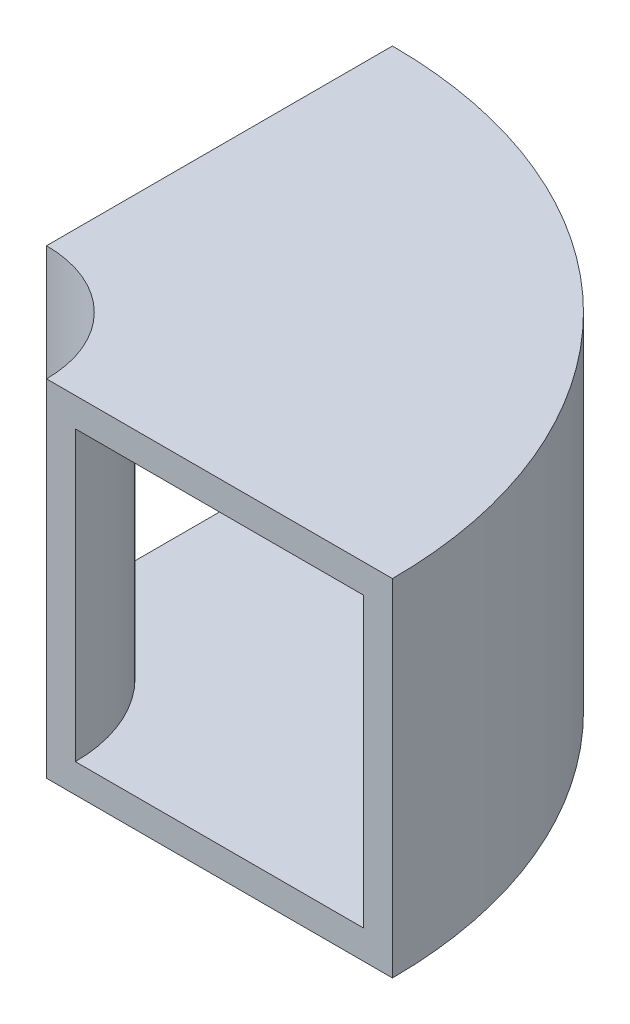
ISO-10303-21;
HEADER;
FILE_DESCRIPTION(('STEP AP214'),'2;1');
FILE_NAME('part.step','',(''),(''),'','','');
FILE_SCHEMA(('AUTOMOTIVE_DESIGN { 1 0 10303 214 1 1 1 1 }'));
ENDSEC;
DATA;
#1=APPLICATION_CONTEXT('core data for automotive mechanical design processes');
#2=APPLICATION_PROTOCOL_DEFINITION('international standard','automotive_design',2000,#1);
#3=PRODUCT_CONTEXT('',#1,'mechanical');
#4=PRODUCT('Part','Part','',(#3));
#5=PRODUCT_RELATED_PRODUCT_CATEGORY('part','',(#4));
#6=PRODUCT_DEFINITION_FORMATION('','',#4);
#7=PRODUCT_DEFINITION_CONTEXT('part definition',#1,'design');
#8=PRODUCT_DEFINITION('design','',#6,#7);
#9=PRODUCT_DEFINITION_SHAPE('','',#8);
#10=(LENGTH_UNIT() NAMED_UNIT(*) SI_UNIT(.MILLI.,.METRE.));
#11=(NAMED_UNIT(*) PLANE_ANGLE_UNIT() SI_UNIT($,.RADIAN.));
#12=(NAMED_UNIT(*) SI_UNIT($,.STERADIAN.) SOLID_ANGLE_UNIT());
#13=UNCERTAINTY_MEASURE_WITH_UNIT(LENGTH_MEASURE(1.E-05),#10,'distance_accuracy_value','');
#14=(GEOMETRIC_REPRESENTATION_CONTEXT(3) GLOBAL_UNCERTAINTY_ASSIGNED_CONTEXT((#13)) GLOBAL_UNIT_ASSIGNED_CONTEXT((#10,
#11,#12)) REPRESENTATION_CONTEXT('',''));
#15=CARTESIAN_POINT('',(0.,0.,0.));
#16=DIRECTION('',(0.,0.,1.));
#17=DIRECTION('',(1.,0.,0.));
#18=AXIS2_PLACEMENT_3D('',#15,#16,#17);
#19=CARTESIAN_POINT('',(0.,0.,0.));
#20=DIRECTION('',(0.,-1.,0.));
#21=DIRECTION('',(0.,0.,-1.));
#22=AXIS2_PLACEMENT_3D('',#19,#20,#21);
#23=CYLINDRICAL_SURFACE('',#22,4.);
#24=CARTESIAN_POINT('',(0.,-1.,0.));
#25=DIRECTION('',(0.,-1.,0.));
#26=DIRECTION('',(0.,0.,-1.));
#27=AXIS2_PLACEMENT_3D('',#24,#25,#26);
#28=CIRCLE('',#27,4.);
#29=CARTESIAN_POINT('',(0.,-1.,-4.));
#30=VERTEX_POINT('',#29);
#31=CARTESIAN_POINT('',(4.,-1.,0.));
#32=VERTEX_POINT('',#31);
#33=EDGE_CURVE('E11',#30,#32,#28,.T.);
#34=ORIENTED_EDGE('',*,*,#33,.T.);
#35=DIRECTION('',(0.,-1.,0.));
#36=VECTOR('',#35,1.);
#37=CARTESIAN_POINT('',(4.,0.,0.));
#38=LINE('',#37,#36);
#39=CARTESIAN_POINT('',(4.,11.,0.));
#40=VERTEX_POINT('',#39);
#41=EDGE_CURVE('E114',#40,#32,#38,.T.);
#42=ORIENTED_EDGE('',*,*,#41,.F.);
#43=CARTESIAN_POINT('',(0.,11.,0.));
#44=DIRECTION('',(0.,-1.,0.));
#45=DIRECTION('',(0.,0.,-1.));
#46=AXIS2_PLACEMENT_3D('',#43,#44,#45);
#47=CIRCLE('',#46,4.);
#48=CARTESIAN_POINT('',(0.,11.,-4.));
#49=VERTEX_POINT('',#48);
#50=EDGE_CURVE('E167',#49,#40,#47,.T.);
#51=ORIENTED_EDGE('',*,*,#50,.F.);
#52=DIRECTION('',(0.,-1.,0.));
#53=VECTOR('',#52,1.);
#54=CARTESIAN_POINT('',(0.,0.,-4.));
#55=LINE('',#54,#53);
#56=EDGE_CURVE('E152',#49,#30,#55,.T.);
#57=ORIENTED_EDGE('',*,*,#56,.T.);
#58=EDGE_LOOP('',(#34,#42,#51,#57));
#59=FACE_BOUND('',#58,.T.);
#60=ADVANCED_FACE('F45',(#59),#23,.F.);
#61=CARTESIAN_POINT('',(0.,-1.,0.));
#62=DIRECTION('',(0.,-1.,0.));
#63=DIRECTION('',(0.,0.,-1.));
#64=AXIS2_PLACEMENT_3D('',#61,#62,#63);
#65=PLANE('',#64);
#66=CARTESIAN_POINT('',(0.,-1.,0.));
#67=DIRECTION('',(0.,-1.,0.));
#68=DIRECTION('',(0.,0.,-1.));
#69=AXIS2_PLACEMENT_3D('',#66,#67,#68);
#70=CIRCLE('',#69,16.);
#71=CARTESIAN_POINT('',(0.,-1.,-16.));
#72=VERTEX_POINT('',#71);
#73=CARTESIAN_POINT('',(16.,-1.,0.));
#74=VERTEX_POINT('',#73);
#75=EDGE_CURVE('E49',#72,#74,#70,.T.);
#76=ORIENTED_EDGE('',*,*,#75,.T.);
#77=DIRECTION('',(1.,0.,0.));
#78=VECTOR('',#77,1.);
#79=CARTESIAN_POINT('',(0.,-1.,0.));
#80=LINE('',#79,#78);
#81=EDGE_CURVE('E144',#32,#74,#80,.T.);
#82=ORIENTED_EDGE('',*,*,#81,.F.);
#83=ORIENTED_EDGE('',*,*,#33,.F.);
#84=DIRECTION('',(0.,0.,-1.));
#85=VECTOR('',#84,1.);
#86=CARTESIAN_POINT('',(0.,-1.,0.));
#87=LINE('',#86,#85);
#88=EDGE_CURVE('E160',#30,#72,#87,.T.);
#89=ORIENTED_EDGE('',*,*,#88,.T.);
#90=EDGE_LOOP('',(#76,#82,#83,#89));
#91=FACE_BOUND('',#90,.T.);
#92=ADVANCED_FACE('F42',(#91),#65,.T.);
#93=CARTESIAN_POINT('',(0.,0.,0.));
#94=DIRECTION('',(0.,-1.,0.));
#95=DIRECTION('',(0.,0.,-1.));
#96=AXIS2_PLACEMENT_3D('',#93,#94,#95);
#97=CYLINDRICAL_SURFACE('',#96,16.);
#98=CARTESIAN_POINT('',(0.,11.,0.));
#99=DIRECTION('',(0.,-1.,0.));
#100=DIRECTION('',(0.,0.,-1.));
#101=AXIS2_PLACEMENT_3D('',#98,#99,#100);
#102=CIRCLE('',#101,16.);
#103=CARTESIAN_POINT('',(0.,11.,-16.));
#104=VERTEX_POINT('',#103);
#105=CARTESIAN_POINT('',(16.,11.,0.));
#106=VERTEX_POINT('',#105);
#107=EDGE_CURVE('E169',#104,#106,#102,.T.);
#108=ORIENTED_EDGE('',*,*,#107,.T.);
#109=DIRECTION('',(0.,1.,0.));
#110=VECTOR('',#109,1.);
#111=CARTESIAN_POINT('',(16.,0.,0.));
#112=LINE('',#111,#110);
#113=EDGE_CURVE('E146',#74,#106,#112,.T.);
#114=ORIENTED_EDGE('',*,*,#113,.F.);
#115=ORIENTED_EDGE('',*,*,#75,.F.);
#116=DIRECTION('',(0.,1.,0.));
#117=VECTOR('',#116,1.);
#118=CARTESIAN_POINT('',(0.,0.,-16.));
#119=LINE('',#118,#117);
#120=EDGE_CURVE('E159',#72,#104,#119,.T.);
#121=ORIENTED_EDGE('',*,*,#120,.T.);
#122=EDGE_LOOP('',(#108,#114,#115,#121));
#123=FACE_BOUND('',#122,.T.);
#124=ADVANCED_FACE('F180',(#123),#97,.T.);
#125=CARTESIAN_POINT('',(0.,11.,0.));
#126=DIRECTION('',(0.,1.,0.));
#127=DIRECTION('',(0.,0.,1.));
#128=AXIS2_PLACEMENT_3D('',#125,#126,#127);
#129=PLANE('',#128);
#130=DIRECTION('',(0.,0.,1.));
#131=VECTOR('',#130,1.);
#132=CARTESIAN_POINT('',(0.,11.,0.));
#133=LINE('',#132,#131);
#134=EDGE_CURVE('E162',#104,#49,#133,.T.);
#135=ORIENTED_EDGE('',*,*,#134,.T.);
#136=ORIENTED_EDGE('',*,*,#50,.T.);
#137=DIRECTION('',(-1.,0.,0.));
#138=VECTOR('',#137,1.);
#139=CARTESIAN_POINT('',(0.,11.,0.));
#140=LINE('',#139,#138);
#141=EDGE_CURVE('E151',#106,#40,#140,.T.);
#142=ORIENTED_EDGE('',*,*,#141,.F.);
#143=ORIENTED_EDGE('',*,*,#107,.F.);
#144=EDGE_LOOP('',(#135,#136,#142,#143));
#145=FACE_BOUND('',#144,.T.);
#146=ADVANCED_FACE('F179',(#145),#129,.T.);
#147=CARTESIAN_POINT('',(0.,0.,0.));
#148=DIRECTION('',(1.,0.,0.));
#149=DIRECTION('',(0.,0.,-1.));
#150=AXIS2_PLACEMENT_3D('',#147,#148,#149);
#151=PLANE('',#150);
#152=DIRECTION('',(0.,0.,1.));
#153=VECTOR('',#152,1.);
#154=CARTESIAN_POINT('',(0.,10.,-5.));
#155=LINE('',#154,#153);
#156=CARTESIAN_POINT('',(0.,10.,-15.));
#157=VERTEX_POINT('',#156);
#158=CARTESIAN_POINT('',(0.,10.,-5.));
#159=VERTEX_POINT('',#158);
#160=EDGE_CURVE('E137',#157,#159,#155,.T.);
#161=ORIENTED_EDGE('',*,*,#160,.T.);
#162=DIRECTION('',(0.,-1.,0.));
#163=VECTOR('',#162,1.);
#164=CARTESIAN_POINT('',(0.,0.,-5.));
#165=LINE('',#164,#163);
#166=CARTESIAN_POINT('',(0.,0.,-5.));
#167=VERTEX_POINT('',#166);
#168=EDGE_CURVE('E60',#159,#167,#165,.T.);
#169=ORIENTED_EDGE('',*,*,#168,.T.);
#170=DIRECTION('',(0.,0.,-1.));
#171=VECTOR('',#170,1.);
#172=CARTESIAN_POINT('',(0.,0.,-5.));
#173=LINE('',#172,#171);
#174=CARTESIAN_POINT('',(0.,0.,-15.));
#175=VERTEX_POINT('',#174);
#176=EDGE_CURVE('E115',#167,#175,#173,.T.);
#177=ORIENTED_EDGE('',*,*,#176,.T.);
#178=DIRECTION('',(0.,1.,0.));
#179=VECTOR('',#178,1.);
#180=CARTESIAN_POINT('',(0.,0.,-15.));
#181=LINE('',#180,#179);
#182=EDGE_CURVE('E132',#175,#157,#181,.T.);
#183=ORIENTED_EDGE('',*,*,#182,.T.);
#184=EDGE_LOOP('',(#161,#169,#177,#183));
#185=FACE_BOUND('',#184,.T.);
#186=ORIENTED_EDGE('',*,*,#56,.F.);
#187=ORIENTED_EDGE('',*,*,#134,.F.);
#188=ORIENTED_EDGE('',*,*,#120,.F.);
#189=ORIENTED_EDGE('',*,*,#88,.F.);
#190=EDGE_LOOP('',(#186,#187,#188,#189));
#191=FACE_BOUND('',#190,.T.);
#192=ADVANCED_FACE('F184',(#185,#191),#151,.F.);
#193=CARTESIAN_POINT('',(0.,0.,0.));
#194=DIRECTION('',(0.,0.,1.));
#195=DIRECTION('',(1.,0.,0.));
#196=AXIS2_PLACEMENT_3D('',#193,#194,#195);
#197=PLANE('',#196);
#198=DIRECTION('',(0.,-1.,0.));
#199=VECTOR('',#198,1.);
#200=CARTESIAN_POINT('',(5.,0.,0.));
#201=LINE('',#200,#199);
#202=CARTESIAN_POINT('',(5.,10.,0.));
#203=VERTEX_POINT('',#202);
#204=CARTESIAN_POINT('',(5.,0.,0.));
#205=VERTEX_POINT('',#204);
#206=EDGE_CURVE('E119',#203,#205,#201,.T.);
#207=ORIENTED_EDGE('',*,*,#206,.F.);
#208=DIRECTION('',(-1.,0.,0.));
#209=VECTOR('',#208,1.);
#210=CARTESIAN_POINT('',(5.,10.,0.));
#211=LINE('',#210,#209);
#212=CARTESIAN_POINT('',(15.,10.,0.));
#213=VERTEX_POINT('',#212);
#214=EDGE_CURVE('E130',#213,#203,#211,.T.);
#215=ORIENTED_EDGE('',*,*,#214,.F.);
#216=DIRECTION('',(0.,1.,0.));
#217=VECTOR('',#216,1.);
#218=CARTESIAN_POINT('',(15.,0.,0.));
#219=LINE('',#218,#217);
#220=CARTESIAN_POINT('',(15.,0.,0.));
#221=VERTEX_POINT('',#220);
#222=EDGE_CURVE('E61',#221,#213,#219,.T.);
#223=ORIENTED_EDGE('',*,*,#222,.F.);
#224=DIRECTION('',(1.,0.,0.));
#225=VECTOR('',#224,1.);
#226=CARTESIAN_POINT('',(5.,0.,0.));
#227=LINE('',#226,#225);
#228=EDGE_CURVE('E109',#205,#221,#227,.T.);
#229=ORIENTED_EDGE('',*,*,#228,.F.);
#230=EDGE_LOOP('',(#207,#215,#223,#229));
#231=FACE_BOUND('',#230,.T.);
#232=ORIENTED_EDGE('',*,*,#41,.T.);
#233=ORIENTED_EDGE('',*,*,#81,.T.);
#234=ORIENTED_EDGE('',*,*,#113,.T.);
#235=ORIENTED_EDGE('',*,*,#141,.T.);
#236=EDGE_LOOP('',(#232,#233,#234,#235));
#237=FACE_BOUND('',#236,.T.);
#238=ADVANCED_FACE('F122',(#231,#237),#197,.T.);
#239=CARTESIAN_POINT('',(0.,0.,0.));
#240=DIRECTION('',(0.,-1.,0.));
#241=DIRECTION('',(0.,0.,-1.));
#242=AXIS2_PLACEMENT_3D('',#239,#240,#241);
#243=CYLINDRICAL_SURFACE('',#242,5.);
#244=CARTESIAN_POINT('',(0.,0.,0.));
#245=DIRECTION('',(0.,-1.,0.));
#246=DIRECTION('',(0.,0.,-1.));
#247=AXIS2_PLACEMENT_3D('',#244,#245,#246);
#248=CIRCLE('',#247,5.);
#249=EDGE_CURVE('E106',#167,#205,#248,.T.);
#250=ORIENTED_EDGE('',*,*,#249,.F.);
#251=ORIENTED_EDGE('',*,*,#168,.F.);
#252=CARTESIAN_POINT('',(0.,10.,0.));
#253=DIRECTION('',(0.,-1.,0.));
#254=DIRECTION('',(0.,0.,-1.));
#255=AXIS2_PLACEMENT_3D('',#252,#253,#254);
#256=CIRCLE('',#255,5.);
#257=EDGE_CURVE('E120',#159,#203,#256,.T.);
#258=ORIENTED_EDGE('',*,*,#257,.T.);
#259=ORIENTED_EDGE('',*,*,#206,.T.);
#260=EDGE_LOOP('',(#250,#251,#258,#259));
#261=FACE_BOUND('',#260,.T.);
#262=ADVANCED_FACE('F117',(#261),#243,.T.);
#263=CARTESIAN_POINT('',(0.,0.,-5.));
#264=DIRECTION('',(0.,-1.,0.));
#265=DIRECTION('',(0.,0.,-1.));
#266=AXIS2_PLACEMENT_3D('',#263,#264,#265);
#267=PLANE('',#266);
#268=CARTESIAN_POINT('',(0.,0.,0.));
#269=DIRECTION('',(0.,-1.,0.));
#270=DIRECTION('',(0.,0.,-1.));
#271=AXIS2_PLACEMENT_3D('',#268,#269,#270);
#272=CIRCLE('',#271,15.);
#273=EDGE_CURVE('E111',#175,#221,#272,.T.);
#274=ORIENTED_EDGE('',*,*,#273,.F.);
#275=ORIENTED_EDGE('',*,*,#176,.F.);
#276=ORIENTED_EDGE('',*,*,#249,.T.);
#277=ORIENTED_EDGE('',*,*,#228,.T.);
#278=EDGE_LOOP('',(#274,#275,#276,#277));
#279=FACE_BOUND('',#278,.T.);
#280=ADVANCED_FACE('F107',(#279),#267,.F.);
#281=CARTESIAN_POINT('',(0.,0.,0.));
#282=DIRECTION('',(0.,-1.,0.));
#283=DIRECTION('',(0.,0.,-1.));
#284=AXIS2_PLACEMENT_3D('',#281,#282,#283);
#285=CYLINDRICAL_SURFACE('',#284,15.);
#286=CARTESIAN_POINT('',(0.,10.,0.));
#287=DIRECTION('',(0.,-1.,0.));
#288=DIRECTION('',(0.,0.,-1.));
#289=AXIS2_PLACEMENT_3D('',#286,#287,#288);
#290=CIRCLE('',#289,15.);
#291=EDGE_CURVE('E136',#157,#213,#290,.T.);
#292=ORIENTED_EDGE('',*,*,#291,.F.);
#293=ORIENTED_EDGE('',*,*,#182,.F.);
#294=ORIENTED_EDGE('',*,*,#273,.T.);
#295=ORIENTED_EDGE('',*,*,#222,.T.);
#296=EDGE_LOOP('',(#292,#293,#294,#295));
#297=FACE_BOUND('',#296,.T.);
#298=ADVANCED_FACE('F240',(#297),#285,.F.);
#299=CARTESIAN_POINT('',(0.,10.,-5.));
#300=DIRECTION('',(0.,1.,0.));
#301=DIRECTION('',(0.,0.,1.));
#302=AXIS2_PLACEMENT_3D('',#299,#300,#301);
#303=PLANE('',#302);
#304=ORIENTED_EDGE('',*,*,#160,.F.);
#305=ORIENTED_EDGE('',*,*,#291,.T.);
#306=ORIENTED_EDGE('',*,*,#214,.T.);
#307=ORIENTED_EDGE('',*,*,#257,.F.);
#308=EDGE_LOOP('',(#304,#305,#306,#307));
#309=FACE_BOUND('',#308,.T.);
#310=ADVANCED_FACE('F247',(#309),#303,.F.);
#311=CLOSED_SHELL('',(#60,#92,#124,#146,#192,#238,#262,#280,#298,#310));
#312=MANIFOLD_SOLID_BREP('B2',#311);
#313=ADVANCED_BREP_SHAPE_REPRESENTATION('',(#18,#312),#14);
#314=SHAPE_DEFINITION_REPRESENTATION(#9,#313);
ENDSEC;
END-ISO-10303-21;
